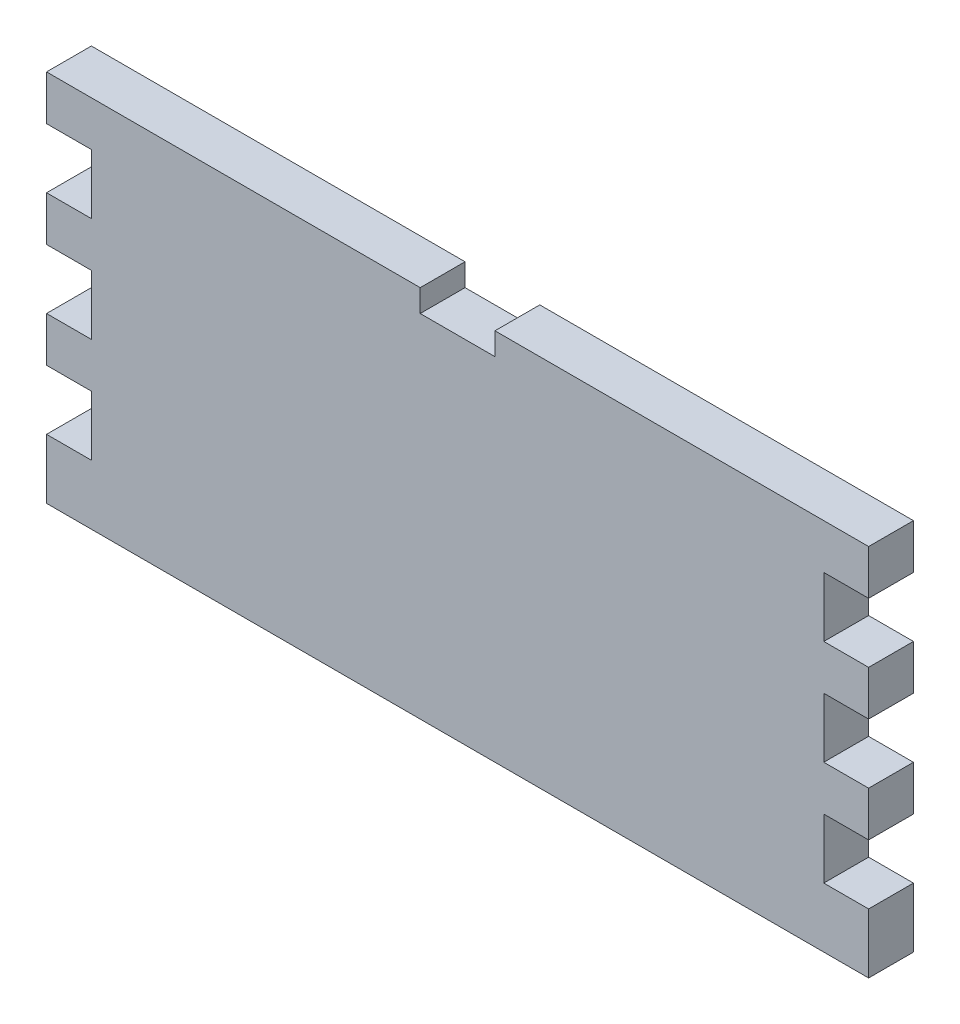
ISO-10303-21;
HEADER;
FILE_DESCRIPTION(('STEP AP214'),'2;1');
FILE_NAME('part.step','',(''),(''),'','','');
FILE_SCHEMA(('AUTOMOTIVE_DESIGN { 1 0 10303 214 1 1 1 1 }'));
ENDSEC;
DATA;
#1=APPLICATION_CONTEXT('core data for automotive mechanical design processes');
#2=APPLICATION_PROTOCOL_DEFINITION('international standard','automotive_design',2000,#1);
#3=PRODUCT_CONTEXT('',#1,'mechanical');
#4=PRODUCT('Part','Part','',(#3));
#5=PRODUCT_RELATED_PRODUCT_CATEGORY('part','',(#4));
#6=PRODUCT_DEFINITION_FORMATION('','',#4);
#7=PRODUCT_DEFINITION_CONTEXT('part definition',#1,'design');
#8=PRODUCT_DEFINITION('design','',#6,#7);
#9=PRODUCT_DEFINITION_SHAPE('','',#8);
#10=(LENGTH_UNIT() NAMED_UNIT(*) SI_UNIT(.MILLI.,.METRE.));
#11=(NAMED_UNIT(*) PLANE_ANGLE_UNIT() SI_UNIT($,.RADIAN.));
#12=(NAMED_UNIT(*) SI_UNIT($,.STERADIAN.) SOLID_ANGLE_UNIT());
#13=UNCERTAINTY_MEASURE_WITH_UNIT(LENGTH_MEASURE(1.E-05),#10,'distance_accuracy_value','');
#14=(GEOMETRIC_REPRESENTATION_CONTEXT(3) GLOBAL_UNCERTAINTY_ASSIGNED_CONTEXT((#13)) GLOBAL_UNIT_ASSIGNED_CONTEXT((#10,
#11,#12)) REPRESENTATION_CONTEXT('',''));
#15=CARTESIAN_POINT('',(0.,0.,0.));
#16=DIRECTION('',(0.,0.,1.));
#17=DIRECTION('',(1.,0.,0.));
#18=AXIS2_PLACEMENT_3D('',#15,#16,#17);
#19=CARTESIAN_POINT('',(27.5,-12.5,3.));
#20=DIRECTION('',(-1.,0.,0.));
#21=DIRECTION('',(0.,0.,1.));
#22=AXIS2_PLACEMENT_3D('',#19,#20,#21);
#23=PLANE('',#22);
#24=DIRECTION('',(0.,1.,0.));
#25=VECTOR('',#24,1.);
#26=CARTESIAN_POINT('',(27.5,-12.5,0.));
#27=LINE('',#26,#25);
#28=CARTESIAN_POINT('',(27.5,2.5,0.));
#29=VERTEX_POINT('',#28);
#30=CARTESIAN_POINT('',(27.5,5.5,0.));
#31=VERTEX_POINT('',#30);
#32=EDGE_CURVE('E270',#29,#31,#27,.T.);
#33=ORIENTED_EDGE('',*,*,#32,.T.);
#34=DIRECTION('',(0.,0.,1.));
#35=VECTOR('',#34,1.);
#36=CARTESIAN_POINT('',(27.5,5.5,0.));
#37=LINE('',#36,#35);
#38=CARTESIAN_POINT('',(27.5,5.5,3.));
#39=VERTEX_POINT('',#38);
#40=EDGE_CURVE('E401',#31,#39,#37,.T.);
#41=ORIENTED_EDGE('',*,*,#40,.T.);
#42=DIRECTION('',(0.,1.,0.));
#43=VECTOR('',#42,1.);
#44=CARTESIAN_POINT('',(27.5,-12.5,3.));
#45=LINE('',#44,#43);
#46=CARTESIAN_POINT('',(27.5,2.5,3.));
#47=VERTEX_POINT('',#46);
#48=EDGE_CURVE('E493',#47,#39,#45,.T.);
#49=ORIENTED_EDGE('',*,*,#48,.F.);
#50=DIRECTION('',(0.,0.,1.));
#51=VECTOR('',#50,1.);
#52=CARTESIAN_POINT('',(27.5,2.5,0.));
#53=LINE('',#52,#51);
#54=EDGE_CURVE('E304',#29,#47,#53,.T.);
#55=ORIENTED_EDGE('',*,*,#54,.F.);
#56=EDGE_LOOP('',(#33,#41,#49,#55));
#57=FACE_BOUND('',#56,.T.);
#58=ADVANCED_FACE('F38',(#57),#23,.F.);
#59=CARTESIAN_POINT('',(27.5,-4.5,0.));
#60=VERTEX_POINT('',#59);
#61=CARTESIAN_POINT('',(27.5,-1.5,0.));
#62=VERTEX_POINT('',#61);
#63=EDGE_CURVE('E275',#60,#62,#27,.T.);
#64=ORIENTED_EDGE('',*,*,#63,.T.);
#65=DIRECTION('',(0.,0.,1.));
#66=VECTOR('',#65,1.);
#67=CARTESIAN_POINT('',(27.5,-1.5,0.));
#68=LINE('',#67,#66);
#69=CARTESIAN_POINT('',(27.5,-1.5,3.));
#70=VERTEX_POINT('',#69);
#71=EDGE_CURVE('E293',#62,#70,#68,.T.);
#72=ORIENTED_EDGE('',*,*,#71,.T.);
#73=CARTESIAN_POINT('',(27.5,-4.5,3.));
#74=VERTEX_POINT('',#73);
#75=EDGE_CURVE('E442',#74,#70,#45,.T.);
#76=ORIENTED_EDGE('',*,*,#75,.F.);
#77=DIRECTION('',(0.,0.,1.));
#78=VECTOR('',#77,1.);
#79=CARTESIAN_POINT('',(27.5,-4.5,0.));
#80=LINE('',#79,#78);
#81=EDGE_CURVE('E295',#60,#74,#80,.T.);
#82=ORIENTED_EDGE('',*,*,#81,.F.);
#83=EDGE_LOOP('',(#64,#72,#76,#82));
#84=FACE_BOUND('',#83,.T.);
#85=ADVANCED_FACE('F291',(#84),#23,.F.);
#86=CARTESIAN_POINT('',(27.5,-12.5,0.));
#87=VERTEX_POINT('',#86);
#88=CARTESIAN_POINT('',(27.5,-8.5,0.));
#89=VERTEX_POINT('',#88);
#90=EDGE_CURVE('E273',#87,#89,#27,.T.);
#91=ORIENTED_EDGE('',*,*,#90,.T.);
#92=DIRECTION('',(0.,0.,1.));
#93=VECTOR('',#92,1.);
#94=CARTESIAN_POINT('',(27.5,-8.5,0.));
#95=LINE('',#94,#93);
#96=CARTESIAN_POINT('',(27.5,-8.5,3.));
#97=VERTEX_POINT('',#96);
#98=EDGE_CURVE('E322',#89,#97,#95,.T.);
#99=ORIENTED_EDGE('',*,*,#98,.T.);
#100=CARTESIAN_POINT('',(27.5,-12.5,3.));
#101=VERTEX_POINT('',#100);
#102=EDGE_CURVE('E438',#101,#97,#45,.T.);
#103=ORIENTED_EDGE('',*,*,#102,.F.);
#104=DIRECTION('',(0.,0.,-1.));
#105=VECTOR('',#104,1.);
#106=CARTESIAN_POINT('',(27.5,-12.5,3.));
#107=LINE('',#106,#105);
#108=EDGE_CURVE('E451',#101,#87,#107,.T.);
#109=ORIENTED_EDGE('',*,*,#108,.T.);
#110=EDGE_LOOP('',(#91,#99,#103,#109));
#111=FACE_BOUND('',#110,.T.);
#112=ADVANCED_FACE('F511',(#111),#23,.F.);
#113=CARTESIAN_POINT('',(-27.5,-12.5,3.));
#114=DIRECTION('',(1.,0.,0.));
#115=DIRECTION('',(0.,0.,-1.));
#116=AXIS2_PLACEMENT_3D('',#113,#114,#115);
#117=PLANE('',#116);
#118=DIRECTION('',(0.,-1.,0.));
#119=VECTOR('',#118,1.);
#120=CARTESIAN_POINT('',(-27.5,-12.5,0.));
#121=LINE('',#120,#119);
#122=CARTESIAN_POINT('',(-27.5,12.5,0.));
#123=VERTEX_POINT('',#122);
#124=CARTESIAN_POINT('',(-27.5,9.50000000000001,0.));
#125=VERTEX_POINT('',#124);
#126=EDGE_CURVE('E470',#123,#125,#121,.T.);
#127=ORIENTED_EDGE('',*,*,#126,.T.);
#128=DIRECTION('',(0.,0.,1.));
#129=VECTOR('',#128,1.);
#130=CARTESIAN_POINT('',(-27.5,9.50000000000001,0.));
#131=LINE('',#130,#129);
#132=CARTESIAN_POINT('',(-27.5,9.50000000000001,3.));
#133=VERTEX_POINT('',#132);
#134=EDGE_CURVE('E356',#125,#133,#131,.T.);
#135=ORIENTED_EDGE('',*,*,#134,.T.);
#136=DIRECTION('',(0.,-1.,0.));
#137=VECTOR('',#136,1.);
#138=CARTESIAN_POINT('',(-27.5,-12.5,3.));
#139=LINE('',#138,#137);
#140=CARTESIAN_POINT('',(-27.5,12.5,3.));
#141=VERTEX_POINT('',#140);
#142=EDGE_CURVE('E447',#141,#133,#139,.T.);
#143=ORIENTED_EDGE('',*,*,#142,.F.);
#144=DIRECTION('',(0.,0.,-1.));
#145=VECTOR('',#144,1.);
#146=CARTESIAN_POINT('',(-27.5,12.5,3.));
#147=LINE('',#146,#145);
#148=EDGE_CURVE('E46',#141,#123,#147,.T.);
#149=ORIENTED_EDGE('',*,*,#148,.T.);
#150=EDGE_LOOP('',(#127,#135,#143,#149));
#151=FACE_BOUND('',#150,.T.);
#152=ADVANCED_FACE('F469',(#151),#117,.F.);
#153=CARTESIAN_POINT('',(-27.5,5.50000000000001,3.));
#154=VERTEX_POINT('',#153);
#155=CARTESIAN_POINT('',(-27.5,2.50000000000001,3.));
#156=VERTEX_POINT('',#155);
#157=EDGE_CURVE('E450',#154,#156,#139,.T.);
#158=ORIENTED_EDGE('',*,*,#157,.F.);
#159=DIRECTION('',(0.,0.,1.));
#160=VECTOR('',#159,1.);
#161=CARTESIAN_POINT('',(-27.5,5.50000000000001,0.));
#162=LINE('',#161,#160);
#163=CARTESIAN_POINT('',(-27.5,5.50000000000001,0.));
#164=VERTEX_POINT('',#163);
#165=EDGE_CURVE('E347',#164,#154,#162,.T.);
#166=ORIENTED_EDGE('',*,*,#165,.F.);
#167=CARTESIAN_POINT('',(-27.5,2.50000000000001,0.));
#168=VERTEX_POINT('',#167);
#169=EDGE_CURVE('E475',#164,#168,#121,.T.);
#170=ORIENTED_EDGE('',*,*,#169,.T.);
#171=DIRECTION('',(0.,0.,1.));
#172=VECTOR('',#171,1.);
#173=CARTESIAN_POINT('',(-27.5,2.50000000000001,0.));
#174=LINE('',#173,#172);
#175=EDGE_CURVE('E372',#168,#156,#174,.T.);
#176=ORIENTED_EDGE('',*,*,#175,.T.);
#177=EDGE_LOOP('',(#158,#166,#170,#176));
#178=FACE_BOUND('',#177,.T.);
#179=ADVANCED_FACE('F518',(#178),#117,.F.);
#180=CARTESIAN_POINT('',(-27.5,-1.5,3.));
#181=VERTEX_POINT('',#180);
#182=CARTESIAN_POINT('',(-27.5,-4.5,3.));
#183=VERTEX_POINT('',#182);
#184=EDGE_CURVE('E650',#181,#183,#139,.T.);
#185=ORIENTED_EDGE('',*,*,#184,.F.);
#186=DIRECTION('',(0.,0.,1.));
#187=VECTOR('',#186,1.);
#188=CARTESIAN_POINT('',(-27.5,-1.5,0.));
#189=LINE('',#188,#187);
#190=CARTESIAN_POINT('',(-27.5,-1.5,0.));
#191=VERTEX_POINT('',#190);
#192=EDGE_CURVE('E365',#191,#181,#189,.T.);
#193=ORIENTED_EDGE('',*,*,#192,.F.);
#194=CARTESIAN_POINT('',(-27.5,-4.5,0.));
#195=VERTEX_POINT('',#194);
#196=EDGE_CURVE('E478',#191,#195,#121,.T.);
#197=ORIENTED_EDGE('',*,*,#196,.T.);
#198=DIRECTION('',(0.,0.,1.));
#199=VECTOR('',#198,1.);
#200=CARTESIAN_POINT('',(-27.5,-4.5,0.));
#201=LINE('',#200,#199);
#202=EDGE_CURVE('E398',#195,#183,#201,.T.);
#203=ORIENTED_EDGE('',*,*,#202,.T.);
#204=EDGE_LOOP('',(#185,#193,#197,#203));
#205=FACE_BOUND('',#204,.T.);
#206=ADVANCED_FACE('F627',(#205),#117,.F.);
#207=CARTESIAN_POINT('',(-27.5,12.5,3.));
#208=DIRECTION('',(0.,-1.,0.));
#209=DIRECTION('',(0.,0.,-1.));
#210=AXIS2_PLACEMENT_3D('',#207,#208,#209);
#211=PLANE('',#210);
#212=DIRECTION('',(-1.,0.,0.));
#213=VECTOR('',#212,1.);
#214=CARTESIAN_POINT('',(-27.5,12.5,3.));
#215=LINE('',#214,#213);
#216=CARTESIAN_POINT('',(-2.49999999999998,12.5,3.));
#217=VERTEX_POINT('',#216);
#218=EDGE_CURVE('E441',#217,#141,#215,.T.);
#219=ORIENTED_EDGE('',*,*,#218,.F.);
#220=DIRECTION('',(0.,0.,1.));
#221=VECTOR('',#220,1.);
#222=CARTESIAN_POINT('',(-2.49999999999998,12.5,0.));
#223=LINE('',#222,#221);
#224=CARTESIAN_POINT('',(-2.49999999999998,12.5,0.));
#225=VERTEX_POINT('',#224);
#226=EDGE_CURVE('E271',#225,#217,#223,.T.);
#227=ORIENTED_EDGE('',*,*,#226,.F.);
#228=DIRECTION('',(-1.,0.,0.));
#229=VECTOR('',#228,1.);
#230=CARTESIAN_POINT('',(-27.5,12.5,0.));
#231=LINE('',#230,#229);
#232=EDGE_CURVE('E281',#225,#123,#231,.T.);
#233=ORIENTED_EDGE('',*,*,#232,.T.);
#234=ORIENTED_EDGE('',*,*,#148,.F.);
#235=EDGE_LOOP('',(#219,#227,#233,#234));
#236=FACE_BOUND('',#235,.T.);
#237=ADVANCED_FACE('F521',(#236),#211,.F.);
#238=CARTESIAN_POINT('',(27.5,9.50000000000001,3.));
#239=VERTEX_POINT('',#238);
#240=CARTESIAN_POINT('',(27.5,12.5,3.));
#241=VERTEX_POINT('',#240);
#242=EDGE_CURVE('E262',#239,#241,#45,.T.);
#243=ORIENTED_EDGE('',*,*,#242,.F.);
#244=DIRECTION('',(0.,0.,1.));
#245=VECTOR('',#244,1.);
#246=CARTESIAN_POINT('',(27.5,9.50000000000001,0.));
#247=LINE('',#246,#245);
#248=CARTESIAN_POINT('',(27.5,9.50000000000001,0.));
#249=VERTEX_POINT('',#248);
#250=EDGE_CURVE('E250',#249,#239,#247,.T.);
#251=ORIENTED_EDGE('',*,*,#250,.F.);
#252=CARTESIAN_POINT('',(27.5,12.5,0.));
#253=VERTEX_POINT('',#252);
#254=EDGE_CURVE('E260',#249,#253,#27,.T.);
#255=ORIENTED_EDGE('',*,*,#254,.T.);
#256=DIRECTION('',(0.,0.,-1.));
#257=VECTOR('',#256,1.);
#258=CARTESIAN_POINT('',(27.5,12.5,3.));
#259=LINE('',#258,#257);
#260=EDGE_CURVE('E11',#241,#253,#259,.T.);
#261=ORIENTED_EDGE('',*,*,#260,.F.);
#262=EDGE_LOOP('',(#243,#251,#255,#261));
#263=FACE_BOUND('',#262,.T.);
#264=ADVANCED_FACE('F40',(#263),#23,.F.);
#265=CARTESIAN_POINT('',(2.50000000000001,12.5,0.));
#266=VERTEX_POINT('',#265);
#267=EDGE_CURVE('E269',#253,#266,#231,.T.);
#268=ORIENTED_EDGE('',*,*,#267,.T.);
#269=DIRECTION('',(0.,0.,1.));
#270=VECTOR('',#269,1.);
#271=CARTESIAN_POINT('',(2.50000000000001,12.5,0.));
#272=LINE('',#271,#270);
#273=CARTESIAN_POINT('',(2.50000000000001,12.5,3.));
#274=VERTEX_POINT('',#273);
#275=EDGE_CURVE('E276',#266,#274,#272,.T.);
#276=ORIENTED_EDGE('',*,*,#275,.T.);
#277=EDGE_CURVE('E443',#241,#274,#215,.T.);
#278=ORIENTED_EDGE('',*,*,#277,.F.);
#279=ORIENTED_EDGE('',*,*,#260,.T.);
#280=EDGE_LOOP('',(#268,#276,#278,#279));
#281=FACE_BOUND('',#280,.T.);
#282=ADVANCED_FACE('F485',(#281),#211,.F.);
#283=CARTESIAN_POINT('',(-27.5,-8.49999999999999,3.));
#284=VERTEX_POINT('',#283);
#285=CARTESIAN_POINT('',(-27.5,-12.5,3.));
#286=VERTEX_POINT('',#285);
#287=EDGE_CURVE('E446',#284,#286,#139,.T.);
#288=ORIENTED_EDGE('',*,*,#287,.F.);
#289=DIRECTION('',(0.,0.,1.));
#290=VECTOR('',#289,1.);
#291=CARTESIAN_POINT('',(-27.5,-8.49999999999999,0.));
#292=LINE('',#291,#290);
#293=CARTESIAN_POINT('',(-27.5,-8.49999999999999,0.));
#294=VERTEX_POINT('',#293);
#295=EDGE_CURVE('E391',#294,#284,#292,.T.);
#296=ORIENTED_EDGE('',*,*,#295,.F.);
#297=CARTESIAN_POINT('',(-27.5,-12.5,0.));
#298=VERTEX_POINT('',#297);
#299=EDGE_CURVE('E476',#294,#298,#121,.T.);
#300=ORIENTED_EDGE('',*,*,#299,.T.);
#301=DIRECTION('',(0.,0.,-1.));
#302=VECTOR('',#301,1.);
#303=CARTESIAN_POINT('',(-27.5,-12.5,3.));
#304=LINE('',#303,#302);
#305=EDGE_CURVE('E455',#286,#298,#304,.T.);
#306=ORIENTED_EDGE('',*,*,#305,.F.);
#307=EDGE_LOOP('',(#288,#296,#300,#306));
#308=FACE_BOUND('',#307,.T.);
#309=ADVANCED_FACE('F520',(#308),#117,.F.);
#310=CARTESIAN_POINT('',(-27.5,-12.5,3.));
#311=DIRECTION('',(0.,1.,0.));
#312=DIRECTION('',(0.,0.,1.));
#313=AXIS2_PLACEMENT_3D('',#310,#311,#312);
#314=PLANE('',#313);
#315=DIRECTION('',(1.,0.,0.));
#316=VECTOR('',#315,1.);
#317=CARTESIAN_POINT('',(-27.5,-12.5,0.));
#318=LINE('',#317,#316);
#319=EDGE_CURVE('E461',#298,#87,#318,.T.);
#320=ORIENTED_EDGE('',*,*,#319,.T.);
#321=ORIENTED_EDGE('',*,*,#108,.F.);
#322=DIRECTION('',(1.,0.,0.));
#323=VECTOR('',#322,1.);
#324=CARTESIAN_POINT('',(-27.5,-12.5,3.));
#325=LINE('',#324,#323);
#326=EDGE_CURVE('E449',#286,#101,#325,.T.);
#327=ORIENTED_EDGE('',*,*,#326,.F.);
#328=ORIENTED_EDGE('',*,*,#305,.T.);
#329=EDGE_LOOP('',(#320,#321,#327,#328));
#330=FACE_BOUND('',#329,.T.);
#331=ADVANCED_FACE('F621',(#330),#314,.F.);
#332=CARTESIAN_POINT('',(0.,0.,3.));
#333=DIRECTION('',(0.,0.,-1.));
#334=DIRECTION('',(-1.,0.,0.));
#335=AXIS2_PLACEMENT_3D('',#332,#333,#334);
#336=PLANE('',#335);
#337=ORIENTED_EDGE('',*,*,#48,.T.);
#338=DIRECTION('',(1.,0.,0.));
#339=VECTOR('',#338,1.);
#340=CARTESIAN_POINT('',(27.5,5.5,3.));
#341=LINE('',#340,#339);
#342=CARTESIAN_POINT('',(24.5,5.5,3.));
#343=VERTEX_POINT('',#342);
#344=EDGE_CURVE('E255',#343,#39,#341,.T.);
#345=ORIENTED_EDGE('',*,*,#344,.F.);
#346=DIRECTION('',(0.,-1.,0.));
#347=VECTOR('',#346,1.);
#348=CARTESIAN_POINT('',(24.5,9.5,3.));
#349=LINE('',#348,#347);
#350=CARTESIAN_POINT('',(24.5,9.5,3.));
#351=VERTEX_POINT('',#350);
#352=EDGE_CURVE('E536',#351,#343,#349,.T.);
#353=ORIENTED_EDGE('',*,*,#352,.F.);
#354=DIRECTION('',(-1.,0.,0.));
#355=VECTOR('',#354,1.);
#356=CARTESIAN_POINT('',(27.5,9.50000000000001,3.));
#357=LINE('',#356,#355);
#358=EDGE_CURVE('E492',#239,#351,#357,.T.);
#359=ORIENTED_EDGE('',*,*,#358,.F.);
#360=ORIENTED_EDGE('',*,*,#242,.T.);
#361=ORIENTED_EDGE('',*,*,#277,.T.);
#362=DIRECTION('',(0.,1.,0.));
#363=VECTOR('',#362,1.);
#364=CARTESIAN_POINT('',(2.50000000000001,12.5,3.));
#365=LINE('',#364,#363);
#366=CARTESIAN_POINT('',(2.50000000000002,11.,3.));
#367=VERTEX_POINT('',#366);
#368=EDGE_CURVE('E421',#367,#274,#365,.T.);
#369=ORIENTED_EDGE('',*,*,#368,.F.);
#370=DIRECTION('',(1.,0.,0.));
#371=VECTOR('',#370,1.);
#372=CARTESIAN_POINT('',(-2.49999999999998,11.,3.));
#373=LINE('',#372,#371);
#374=CARTESIAN_POINT('',(-2.49999999999998,11.,3.));
#375=VERTEX_POINT('',#374);
#376=EDGE_CURVE('E429',#375,#367,#373,.T.);
#377=ORIENTED_EDGE('',*,*,#376,.F.);
#378=DIRECTION('',(0.,-1.,0.));
#379=VECTOR('',#378,1.);
#380=CARTESIAN_POINT('',(-2.49999999999998,12.5,3.));
#381=LINE('',#380,#379);
#382=EDGE_CURVE('E359',#217,#375,#381,.T.);
#383=ORIENTED_EDGE('',*,*,#382,.F.);
#384=ORIENTED_EDGE('',*,*,#218,.T.);
#385=ORIENTED_EDGE('',*,*,#142,.T.);
#386=DIRECTION('',(-1.,0.,0.));
#387=VECTOR('',#386,1.);
#388=CARTESIAN_POINT('',(-27.5,9.50000000000001,3.));
#389=LINE('',#388,#387);
#390=CARTESIAN_POINT('',(-24.5,9.50000000000001,3.));
#391=VERTEX_POINT('',#390);
#392=EDGE_CURVE('E341',#391,#133,#389,.T.);
#393=ORIENTED_EDGE('',*,*,#392,.F.);
#394=DIRECTION('',(0.,1.,0.));
#395=VECTOR('',#394,1.);
#396=CARTESIAN_POINT('',(-24.5,9.50000000000001,3.));
#397=LINE('',#396,#395);
#398=CARTESIAN_POINT('',(-24.5,5.50000000000001,3.));
#399=VERTEX_POINT('',#398);
#400=EDGE_CURVE('E351',#399,#391,#397,.T.);
#401=ORIENTED_EDGE('',*,*,#400,.F.);
#402=DIRECTION('',(1.,0.,0.));
#403=VECTOR('',#402,1.);
#404=CARTESIAN_POINT('',(-27.5,5.50000000000001,3.));
#405=LINE('',#404,#403);
#406=EDGE_CURVE('E348',#154,#399,#405,.T.);
#407=ORIENTED_EDGE('',*,*,#406,.F.);
#408=ORIENTED_EDGE('',*,*,#157,.T.);
#409=DIRECTION('',(-1.,0.,0.));
#410=VECTOR('',#409,1.);
#411=CARTESIAN_POINT('',(-27.5,2.50000000000001,3.));
#412=LINE('',#411,#410);
#413=CARTESIAN_POINT('',(-24.5,2.5,3.));
#414=VERTEX_POINT('',#413);
#415=EDGE_CURVE('E376',#414,#156,#412,.T.);
#416=ORIENTED_EDGE('',*,*,#415,.F.);
#417=DIRECTION('',(0.,1.,0.));
#418=VECTOR('',#417,1.);
#419=CARTESIAN_POINT('',(-24.5,2.5,3.));
#420=LINE('',#419,#418);
#421=CARTESIAN_POINT('',(-24.5,-1.5,3.));
#422=VERTEX_POINT('',#421);
#423=EDGE_CURVE('E378',#422,#414,#420,.T.);
#424=ORIENTED_EDGE('',*,*,#423,.F.);
#425=DIRECTION('',(1.,0.,0.));
#426=VECTOR('',#425,1.);
#427=CARTESIAN_POINT('',(-27.5,-1.5,3.));
#428=LINE('',#427,#426);
#429=EDGE_CURVE('E352',#181,#422,#428,.T.);
#430=ORIENTED_EDGE('',*,*,#429,.F.);
#431=ORIENTED_EDGE('',*,*,#184,.T.);
#432=DIRECTION('',(-1.,0.,0.));
#433=VECTOR('',#432,1.);
#434=CARTESIAN_POINT('',(-27.5,-4.5,3.));
#435=LINE('',#434,#433);
#436=CARTESIAN_POINT('',(-24.5,-4.5,3.));
#437=VERTEX_POINT('',#436);
#438=EDGE_CURVE('E402',#437,#183,#435,.T.);
#439=ORIENTED_EDGE('',*,*,#438,.F.);
#440=DIRECTION('',(0.,1.,0.));
#441=VECTOR('',#440,1.);
#442=CARTESIAN_POINT('',(-24.5,-4.5,3.));
#443=LINE('',#442,#441);
#444=CARTESIAN_POINT('',(-24.5,-8.49999999999999,3.));
#445=VERTEX_POINT('',#444);
#446=EDGE_CURVE('E404',#445,#437,#443,.T.);
#447=ORIENTED_EDGE('',*,*,#446,.F.);
#448=DIRECTION('',(1.,0.,0.));
#449=VECTOR('',#448,1.);
#450=CARTESIAN_POINT('',(-27.5,-8.49999999999999,3.));
#451=LINE('',#450,#449);
#452=EDGE_CURVE('E375',#284,#445,#451,.T.);
#453=ORIENTED_EDGE('',*,*,#452,.F.);
#454=ORIENTED_EDGE('',*,*,#287,.T.);
#455=ORIENTED_EDGE('',*,*,#326,.T.);
#456=ORIENTED_EDGE('',*,*,#102,.T.);
#457=DIRECTION('',(1.,0.,0.));
#458=VECTOR('',#457,1.);
#459=CARTESIAN_POINT('',(27.5,-8.5,3.));
#460=LINE('',#459,#458);
#461=CARTESIAN_POINT('',(24.5,-8.49999999999999,3.));
#462=VERTEX_POINT('',#461);
#463=EDGE_CURVE('E324',#462,#97,#460,.T.);
#464=ORIENTED_EDGE('',*,*,#463,.F.);
#465=DIRECTION('',(0.,-1.,0.));
#466=VECTOR('',#465,1.);
#467=CARTESIAN_POINT('',(24.5,-4.5,3.));
#468=LINE('',#467,#466);
#469=CARTESIAN_POINT('',(24.5,-4.5,3.));
#470=VERTEX_POINT('',#469);
#471=EDGE_CURVE('E326',#470,#462,#468,.T.);
#472=ORIENTED_EDGE('',*,*,#471,.F.);
#473=DIRECTION('',(-1.,0.,0.));
#474=VECTOR('',#473,1.);
#475=CARTESIAN_POINT('',(27.5,-4.5,3.));
#476=LINE('',#475,#474);
#477=EDGE_CURVE('E329',#74,#470,#476,.T.);
#478=ORIENTED_EDGE('',*,*,#477,.F.);
#479=ORIENTED_EDGE('',*,*,#75,.T.);
#480=DIRECTION('',(1.,0.,0.));
#481=VECTOR('',#480,1.);
#482=CARTESIAN_POINT('',(27.5,-1.5,3.));
#483=LINE('',#482,#481);
#484=CARTESIAN_POINT('',(24.5,-1.5,3.));
#485=VERTEX_POINT('',#484);
#486=EDGE_CURVE('E315',#485,#70,#483,.T.);
#487=ORIENTED_EDGE('',*,*,#486,.F.);
#488=DIRECTION('',(0.,-1.,0.));
#489=VECTOR('',#488,1.);
#490=CARTESIAN_POINT('',(24.5,2.5,3.));
#491=LINE('',#490,#489);
#492=CARTESIAN_POINT('',(24.5,2.5,3.));
#493=VERTEX_POINT('',#492);
#494=EDGE_CURVE('E548',#493,#485,#491,.T.);
#495=ORIENTED_EDGE('',*,*,#494,.F.);
#496=DIRECTION('',(-1.,0.,0.));
#497=VECTOR('',#496,1.);
#498=CARTESIAN_POINT('',(27.5,2.5,3.));
#499=LINE('',#498,#497);
#500=EDGE_CURVE('E311',#47,#493,#499,.T.);
#501=ORIENTED_EDGE('',*,*,#500,.F.);
#502=EDGE_LOOP('',(#337,#345,#353,#359,#360,#361,#369,#377,#383,#384,#385,#393,#401,#407,#408,
#416,#424,#430,#431,#439,#447,#453,#454,#455,#456,#464,#472,#478,#479,#487,#495,#501));
#503=FACE_BOUND('',#502,.T.);
#504=ADVANCED_FACE('F489',(#503),#336,.F.);
#505=CARTESIAN_POINT('',(0.,0.,0.));
#506=DIRECTION('',(0.,0.,-1.));
#507=DIRECTION('',(-1.,0.,0.));
#508=AXIS2_PLACEMENT_3D('',#505,#506,#507);
#509=PLANE('',#508);
#510=DIRECTION('',(1.,0.,0.));
#511=VECTOR('',#510,1.);
#512=CARTESIAN_POINT('',(27.5,5.5,0.));
#513=LINE('',#512,#511);
#514=CARTESIAN_POINT('',(24.5,5.5,0.));
#515=VERTEX_POINT('',#514);
#516=EDGE_CURVE('E263',#515,#31,#513,.T.);
#517=ORIENTED_EDGE('',*,*,#516,.T.);
#518=ORIENTED_EDGE('',*,*,#32,.F.);
#519=DIRECTION('',(-1.,0.,0.));
#520=VECTOR('',#519,1.);
#521=CARTESIAN_POINT('',(27.5,2.5,0.));
#522=LINE('',#521,#520);
#523=CARTESIAN_POINT('',(24.5,2.5,0.));
#524=VERTEX_POINT('',#523);
#525=EDGE_CURVE('E306',#29,#524,#522,.T.);
#526=ORIENTED_EDGE('',*,*,#525,.T.);
#527=DIRECTION('',(0.,-1.,0.));
#528=VECTOR('',#527,1.);
#529=CARTESIAN_POINT('',(24.5,2.5,0.));
#530=LINE('',#529,#528);
#531=CARTESIAN_POINT('',(24.5,-1.5,0.));
#532=VERTEX_POINT('',#531);
#533=EDGE_CURVE('E61',#524,#532,#530,.T.);
#534=ORIENTED_EDGE('',*,*,#533,.T.);
#535=DIRECTION('',(1.,0.,0.));
#536=VECTOR('',#535,1.);
#537=CARTESIAN_POINT('',(27.5,-1.5,0.));
#538=LINE('',#537,#536);
#539=EDGE_CURVE('E301',#532,#62,#538,.T.);
#540=ORIENTED_EDGE('',*,*,#539,.T.);
#541=ORIENTED_EDGE('',*,*,#63,.F.);
#542=DIRECTION('',(-1.,0.,0.));
#543=VECTOR('',#542,1.);
#544=CARTESIAN_POINT('',(27.5,-4.5,0.));
#545=LINE('',#544,#543);
#546=CARTESIAN_POINT('',(24.5,-4.5,0.));
#547=VERTEX_POINT('',#546);
#548=EDGE_CURVE('E299',#60,#547,#545,.T.);
#549=ORIENTED_EDGE('',*,*,#548,.T.);
#550=DIRECTION('',(0.,-1.,0.));
#551=VECTOR('',#550,1.);
#552=CARTESIAN_POINT('',(24.5,-4.5,0.));
#553=LINE('',#552,#551);
#554=CARTESIAN_POINT('',(24.5,-8.49999999999999,0.));
#555=VERTEX_POINT('',#554);
#556=EDGE_CURVE('E334',#547,#555,#553,.T.);
#557=ORIENTED_EDGE('',*,*,#556,.T.);
#558=DIRECTION('',(1.,0.,0.));
#559=VECTOR('',#558,1.);
#560=CARTESIAN_POINT('',(27.5,-8.5,0.));
#561=LINE('',#560,#559);
#562=EDGE_CURVE('E317',#555,#89,#561,.T.);
#563=ORIENTED_EDGE('',*,*,#562,.T.);
#564=ORIENTED_EDGE('',*,*,#90,.F.);
#565=ORIENTED_EDGE('',*,*,#319,.F.);
#566=ORIENTED_EDGE('',*,*,#299,.F.);
#567=DIRECTION('',(1.,0.,0.));
#568=VECTOR('',#567,1.);
#569=CARTESIAN_POINT('',(-27.5,-8.49999999999999,0.));
#570=LINE('',#569,#568);
#571=CARTESIAN_POINT('',(-24.5,-8.49999999999999,0.));
#572=VERTEX_POINT('',#571);
#573=EDGE_CURVE('E405',#294,#572,#570,.T.);
#574=ORIENTED_EDGE('',*,*,#573,.T.);
#575=DIRECTION('',(0.,1.,0.));
#576=VECTOR('',#575,1.);
#577=CARTESIAN_POINT('',(-24.5,-4.5,0.));
#578=LINE('',#577,#576);
#579=CARTESIAN_POINT('',(-24.5,-4.5,0.));
#580=VERTEX_POINT('',#579);
#581=EDGE_CURVE('E412',#572,#580,#578,.T.);
#582=ORIENTED_EDGE('',*,*,#581,.T.);
#583=DIRECTION('',(-1.,0.,0.));
#584=VECTOR('',#583,1.);
#585=CARTESIAN_POINT('',(-27.5,-4.5,0.));
#586=LINE('',#585,#584);
#587=EDGE_CURVE('E393',#580,#195,#586,.T.);
#588=ORIENTED_EDGE('',*,*,#587,.T.);
#589=ORIENTED_EDGE('',*,*,#196,.F.);
#590=DIRECTION('',(1.,0.,0.));
#591=VECTOR('',#590,1.);
#592=CARTESIAN_POINT('',(-27.5,-1.5,0.));
#593=LINE('',#592,#591);
#594=CARTESIAN_POINT('',(-24.5,-1.5,0.));
#595=VERTEX_POINT('',#594);
#596=EDGE_CURVE('E379',#191,#595,#593,.T.);
#597=ORIENTED_EDGE('',*,*,#596,.T.);
#598=DIRECTION('',(0.,1.,0.));
#599=VECTOR('',#598,1.);
#600=CARTESIAN_POINT('',(-24.5,2.5,0.));
#601=LINE('',#600,#599);
#602=CARTESIAN_POINT('',(-24.5,2.5,0.));
#603=VERTEX_POINT('',#602);
#604=EDGE_CURVE('E386',#595,#603,#601,.T.);
#605=ORIENTED_EDGE('',*,*,#604,.T.);
#606=DIRECTION('',(-1.,0.,0.));
#607=VECTOR('',#606,1.);
#608=CARTESIAN_POINT('',(-27.5,2.50000000000001,0.));
#609=LINE('',#608,#607);
#610=EDGE_CURVE('E367',#603,#168,#609,.T.);
#611=ORIENTED_EDGE('',*,*,#610,.T.);
#612=ORIENTED_EDGE('',*,*,#169,.F.);
#613=DIRECTION('',(1.,0.,0.));
#614=VECTOR('',#613,1.);
#615=CARTESIAN_POINT('',(-27.5,5.50000000000001,0.));
#616=LINE('',#615,#614);
#617=CARTESIAN_POINT('',(-24.5,5.50000000000001,0.));
#618=VERTEX_POINT('',#617);
#619=EDGE_CURVE('E337',#164,#618,#616,.T.);
#620=ORIENTED_EDGE('',*,*,#619,.T.);
#621=DIRECTION('',(0.,1.,0.));
#622=VECTOR('',#621,1.);
#623=CARTESIAN_POINT('',(-24.5,9.50000000000001,0.));
#624=LINE('',#623,#622);
#625=CARTESIAN_POINT('',(-24.5,9.50000000000001,0.));
#626=VERTEX_POINT('',#625);
#627=EDGE_CURVE('E340',#618,#626,#624,.T.);
#628=ORIENTED_EDGE('',*,*,#627,.T.);
#629=DIRECTION('',(-1.,0.,0.));
#630=VECTOR('',#629,1.);
#631=CARTESIAN_POINT('',(-27.5,9.50000000000001,0.));
#632=LINE('',#631,#630);
#633=EDGE_CURVE('E344',#626,#125,#632,.T.);
#634=ORIENTED_EDGE('',*,*,#633,.T.);
#635=ORIENTED_EDGE('',*,*,#126,.F.);
#636=ORIENTED_EDGE('',*,*,#232,.F.);
#637=DIRECTION('',(0.,-1.,0.));
#638=VECTOR('',#637,1.);
#639=CARTESIAN_POINT('',(-2.49999999999998,12.5,0.));
#640=LINE('',#639,#638);
#641=CARTESIAN_POINT('',(-2.49999999999998,11.,0.));
#642=VERTEX_POINT('',#641);
#643=EDGE_CURVE('E417',#225,#642,#640,.T.);
#644=ORIENTED_EDGE('',*,*,#643,.T.);
#645=DIRECTION('',(1.,0.,0.));
#646=VECTOR('',#645,1.);
#647=CARTESIAN_POINT('',(-2.49999999999998,11.,0.));
#648=LINE('',#647,#646);
#649=CARTESIAN_POINT('',(2.50000000000002,11.,0.));
#650=VERTEX_POINT('',#649);
#651=EDGE_CURVE('E420',#642,#650,#648,.T.);
#652=ORIENTED_EDGE('',*,*,#651,.T.);
#653=DIRECTION('',(0.,1.,0.));
#654=VECTOR('',#653,1.);
#655=CARTESIAN_POINT('',(2.50000000000001,12.5,0.));
#656=LINE('',#655,#654);
#657=EDGE_CURVE('E424',#650,#266,#656,.T.);
#658=ORIENTED_EDGE('',*,*,#657,.T.);
#659=ORIENTED_EDGE('',*,*,#267,.F.);
#660=ORIENTED_EDGE('',*,*,#254,.F.);
#661=DIRECTION('',(-1.,0.,0.));
#662=VECTOR('',#661,1.);
#663=CARTESIAN_POINT('',(27.5,9.50000000000001,0.));
#664=LINE('',#663,#662);
#665=CARTESIAN_POINT('',(24.5,9.5,0.));
#666=VERTEX_POINT('',#665);
#667=EDGE_CURVE('E246',#249,#666,#664,.T.);
#668=ORIENTED_EDGE('',*,*,#667,.T.);
#669=DIRECTION('',(0.,-1.,0.));
#670=VECTOR('',#669,1.);
#671=CARTESIAN_POINT('',(24.5,9.5,0.));
#672=LINE('',#671,#670);
#673=EDGE_CURVE('E53',#666,#515,#672,.T.);
#674=ORIENTED_EDGE('',*,*,#673,.T.);
#675=EDGE_LOOP('',(#517,#518,#526,#534,#540,#541,#549,#557,#563,#564,#565,#566,#574,#582,#588,
#589,#597,#605,#611,#612,#620,#628,#634,#635,#636,#644,#652,#658,#659,#660,#668,#674));
#676=FACE_BOUND('',#675,.T.);
#677=ADVANCED_FACE('F266',(#676),#509,.T.);
#678=CARTESIAN_POINT('',(-2.49999999999998,12.5,0.));
#679=DIRECTION('',(-1.,0.,0.));
#680=DIRECTION('',(0.,-1.,0.));
#681=AXIS2_PLACEMENT_3D('',#678,#679,#680);
#682=PLANE('',#681);
#683=ORIENTED_EDGE('',*,*,#382,.T.);
#684=DIRECTION('',(0.,0.,1.));
#685=VECTOR('',#684,1.);
#686=CARTESIAN_POINT('',(-2.49999999999998,11.,0.));
#687=LINE('',#686,#685);
#688=EDGE_CURVE('E426',#642,#375,#687,.T.);
#689=ORIENTED_EDGE('',*,*,#688,.F.);
#690=ORIENTED_EDGE('',*,*,#643,.F.);
#691=ORIENTED_EDGE('',*,*,#226,.T.);
#692=EDGE_LOOP('',(#683,#689,#690,#691));
#693=FACE_BOUND('',#692,.T.);
#694=ADVANCED_FACE('F611',(#693),#682,.F.);
#695=CARTESIAN_POINT('',(2.50000000000001,12.5,0.));
#696=DIRECTION('',(1.,0.,0.));
#697=DIRECTION('',(0.,1.,0.));
#698=AXIS2_PLACEMENT_3D('',#695,#696,#697);
#699=PLANE('',#698);
#700=ORIENTED_EDGE('',*,*,#368,.T.);
#701=ORIENTED_EDGE('',*,*,#275,.F.);
#702=ORIENTED_EDGE('',*,*,#657,.F.);
#703=DIRECTION('',(0.,0.,1.));
#704=VECTOR('',#703,1.);
#705=CARTESIAN_POINT('',(2.50000000000002,11.,0.));
#706=LINE('',#705,#704);
#707=EDGE_CURVE('E435',#650,#367,#706,.T.);
#708=ORIENTED_EDGE('',*,*,#707,.T.);
#709=EDGE_LOOP('',(#700,#701,#702,#708));
#710=FACE_BOUND('',#709,.T.);
#711=ADVANCED_FACE('F608',(#710),#699,.F.);
#712=CARTESIAN_POINT('',(-2.49999999999998,11.,0.));
#713=DIRECTION('',(0.,-1.,0.));
#714=DIRECTION('',(1.,0.,0.));
#715=AXIS2_PLACEMENT_3D('',#712,#713,#714);
#716=PLANE('',#715);
#717=ORIENTED_EDGE('',*,*,#376,.T.);
#718=ORIENTED_EDGE('',*,*,#707,.F.);
#719=ORIENTED_EDGE('',*,*,#651,.F.);
#720=ORIENTED_EDGE('',*,*,#688,.T.);
#721=EDGE_LOOP('',(#717,#718,#719,#720));
#722=FACE_BOUND('',#721,.T.);
#723=ADVANCED_FACE('F606',(#722),#716,.F.);
#724=CARTESIAN_POINT('',(-27.5,-4.5,0.));
#725=DIRECTION('',(0.,1.,0.));
#726=DIRECTION('',(-1.,0.,0.));
#727=AXIS2_PLACEMENT_3D('',#724,#725,#726);
#728=PLANE('',#727);
#729=ORIENTED_EDGE('',*,*,#438,.T.);
#730=ORIENTED_EDGE('',*,*,#202,.F.);
#731=ORIENTED_EDGE('',*,*,#587,.F.);
#732=DIRECTION('',(0.,0.,1.));
#733=VECTOR('',#732,1.);
#734=CARTESIAN_POINT('',(-24.5,-4.5,0.));
#735=LINE('',#734,#733);
#736=EDGE_CURVE('E396',#580,#437,#735,.T.);
#737=ORIENTED_EDGE('',*,*,#736,.T.);
#738=EDGE_LOOP('',(#729,#730,#731,#737));
#739=FACE_BOUND('',#738,.T.);
#740=ADVANCED_FACE('F602',(#739),#728,.F.);
#741=CARTESIAN_POINT('',(-24.5,-4.5,0.));
#742=DIRECTION('',(1.,0.,0.));
#743=DIRECTION('',(0.,0.,-1.));
#744=AXIS2_PLACEMENT_3D('',#741,#742,#743);
#745=PLANE('',#744);
#746=ORIENTED_EDGE('',*,*,#446,.T.);
#747=ORIENTED_EDGE('',*,*,#736,.F.);
#748=ORIENTED_EDGE('',*,*,#581,.F.);
#749=DIRECTION('',(0.,0.,1.));
#750=VECTOR('',#749,1.);
#751=CARTESIAN_POINT('',(-24.5,-8.49999999999999,0.));
#752=LINE('',#751,#750);
#753=EDGE_CURVE('E394',#572,#445,#752,.T.);
#754=ORIENTED_EDGE('',*,*,#753,.T.);
#755=EDGE_LOOP('',(#746,#747,#748,#754));
#756=FACE_BOUND('',#755,.T.);
#757=ADVANCED_FACE('F598',(#756),#745,.F.);
#758=CARTESIAN_POINT('',(-27.5,-8.49999999999999,0.));
#759=DIRECTION('',(0.,-1.,0.));
#760=DIRECTION('',(0.,0.,-1.));
#761=AXIS2_PLACEMENT_3D('',#758,#759,#760);
#762=PLANE('',#761);
#763=ORIENTED_EDGE('',*,*,#452,.T.);
#764=ORIENTED_EDGE('',*,*,#753,.F.);
#765=ORIENTED_EDGE('',*,*,#573,.F.);
#766=ORIENTED_EDGE('',*,*,#295,.T.);
#767=EDGE_LOOP('',(#763,#764,#765,#766));
#768=FACE_BOUND('',#767,.T.);
#769=ADVANCED_FACE('F594',(#768),#762,.F.);
#770=CARTESIAN_POINT('',(-27.5,2.50000000000001,0.));
#771=DIRECTION('',(0.,1.,0.));
#772=DIRECTION('',(-1.,0.,0.));
#773=AXIS2_PLACEMENT_3D('',#770,#771,#772);
#774=PLANE('',#773);
#775=ORIENTED_EDGE('',*,*,#415,.T.);
#776=ORIENTED_EDGE('',*,*,#175,.F.);
#777=ORIENTED_EDGE('',*,*,#610,.F.);
#778=DIRECTION('',(0.,0.,1.));
#779=VECTOR('',#778,1.);
#780=CARTESIAN_POINT('',(-24.5,2.5,0.));
#781=LINE('',#780,#779);
#782=EDGE_CURVE('E370',#603,#414,#781,.T.);
#783=ORIENTED_EDGE('',*,*,#782,.T.);
#784=EDGE_LOOP('',(#775,#776,#777,#783));
#785=FACE_BOUND('',#784,.T.);
#786=ADVANCED_FACE('F590',(#785),#774,.F.);
#787=CARTESIAN_POINT('',(-24.5,2.5,0.));
#788=DIRECTION('',(1.,0.,0.));
#789=DIRECTION('',(0.,0.,-1.));
#790=AXIS2_PLACEMENT_3D('',#787,#788,#789);
#791=PLANE('',#790);
#792=ORIENTED_EDGE('',*,*,#423,.T.);
#793=ORIENTED_EDGE('',*,*,#782,.F.);
#794=ORIENTED_EDGE('',*,*,#604,.F.);
#795=DIRECTION('',(0.,0.,1.));
#796=VECTOR('',#795,1.);
#797=CARTESIAN_POINT('',(-24.5,-1.5,0.));
#798=LINE('',#797,#796);
#799=EDGE_CURVE('E368',#595,#422,#798,.T.);
#800=ORIENTED_EDGE('',*,*,#799,.T.);
#801=EDGE_LOOP('',(#792,#793,#794,#800));
#802=FACE_BOUND('',#801,.T.);
#803=ADVANCED_FACE('F586',(#802),#791,.F.);
#804=CARTESIAN_POINT('',(-27.5,-1.5,0.));
#805=DIRECTION('',(0.,-1.,0.));
#806=DIRECTION('',(1.,0.,0.));
#807=AXIS2_PLACEMENT_3D('',#804,#805,#806);
#808=PLANE('',#807);
#809=ORIENTED_EDGE('',*,*,#429,.T.);
#810=ORIENTED_EDGE('',*,*,#799,.F.);
#811=ORIENTED_EDGE('',*,*,#596,.F.);
#812=ORIENTED_EDGE('',*,*,#192,.T.);
#813=EDGE_LOOP('',(#809,#810,#811,#812));
#814=FACE_BOUND('',#813,.T.);
#815=ADVANCED_FACE('F577',(#814),#808,.F.);
#816=CARTESIAN_POINT('',(-27.5,9.50000000000001,0.));
#817=DIRECTION('',(0.,1.,0.));
#818=DIRECTION('',(0.,0.,1.));
#819=AXIS2_PLACEMENT_3D('',#816,#817,#818);
#820=PLANE('',#819);
#821=ORIENTED_EDGE('',*,*,#392,.T.);
#822=ORIENTED_EDGE('',*,*,#134,.F.);
#823=ORIENTED_EDGE('',*,*,#633,.F.);
#824=DIRECTION('',(0.,0.,1.));
#825=VECTOR('',#824,1.);
#826=CARTESIAN_POINT('',(-24.5,9.50000000000001,0.));
#827=LINE('',#826,#825);
#828=EDGE_CURVE('E360',#626,#391,#827,.T.);
#829=ORIENTED_EDGE('',*,*,#828,.T.);
#830=EDGE_LOOP('',(#821,#822,#823,#829));
#831=FACE_BOUND('',#830,.T.);
#832=ADVANCED_FACE('F573',(#831),#820,.F.);
#833=CARTESIAN_POINT('',(-24.5,9.50000000000001,0.));
#834=DIRECTION('',(1.,0.,0.));
#835=DIRECTION('',(0.,0.,-1.));
#836=AXIS2_PLACEMENT_3D('',#833,#834,#835);
#837=PLANE('',#836);
#838=ORIENTED_EDGE('',*,*,#400,.T.);
#839=ORIENTED_EDGE('',*,*,#828,.F.);
#840=ORIENTED_EDGE('',*,*,#627,.F.);
#841=DIRECTION('',(0.,0.,1.));
#842=VECTOR('',#841,1.);
#843=CARTESIAN_POINT('',(-24.5,5.50000000000001,0.));
#844=LINE('',#843,#842);
#845=EDGE_CURVE('E362',#618,#399,#844,.T.);
#846=ORIENTED_EDGE('',*,*,#845,.T.);
#847=EDGE_LOOP('',(#838,#839,#840,#846));
#848=FACE_BOUND('',#847,.T.);
#849=ADVANCED_FACE('F576',(#848),#837,.F.);
#850=CARTESIAN_POINT('',(-27.5,5.50000000000001,0.));
#851=DIRECTION('',(0.,-1.,0.));
#852=DIRECTION('',(0.,0.,-1.));
#853=AXIS2_PLACEMENT_3D('',#850,#851,#852);
#854=PLANE('',#853);
#855=ORIENTED_EDGE('',*,*,#406,.T.);
#856=ORIENTED_EDGE('',*,*,#845,.F.);
#857=ORIENTED_EDGE('',*,*,#619,.F.);
#858=ORIENTED_EDGE('',*,*,#165,.T.);
#859=EDGE_LOOP('',(#855,#856,#857,#858));
#860=FACE_BOUND('',#859,.T.);
#861=ADVANCED_FACE('F572',(#860),#854,.F.);
#862=CARTESIAN_POINT('',(27.5,-8.5,0.));
#863=DIRECTION('',(0.,-1.,0.));
#864=DIRECTION('',(1.,0.,0.));
#865=AXIS2_PLACEMENT_3D('',#862,#863,#864);
#866=PLANE('',#865);
#867=ORIENTED_EDGE('',*,*,#463,.T.);
#868=ORIENTED_EDGE('',*,*,#98,.F.);
#869=ORIENTED_EDGE('',*,*,#562,.F.);
#870=DIRECTION('',(0.,0.,1.));
#871=VECTOR('',#870,1.);
#872=CARTESIAN_POINT('',(24.5,-8.49999999999999,0.));
#873=LINE('',#872,#871);
#874=EDGE_CURVE('E320',#555,#462,#873,.T.);
#875=ORIENTED_EDGE('',*,*,#874,.T.);
#876=EDGE_LOOP('',(#867,#868,#869,#875));
#877=FACE_BOUND('',#876,.T.);
#878=ADVANCED_FACE('F510',(#877),#866,.F.);
#879=CARTESIAN_POINT('',(24.5,-4.5,0.));
#880=DIRECTION('',(-1.,0.,0.));
#881=DIRECTION('',(0.,0.,1.));
#882=AXIS2_PLACEMENT_3D('',#879,#880,#881);
#883=PLANE('',#882);
#884=ORIENTED_EDGE('',*,*,#471,.T.);
#885=ORIENTED_EDGE('',*,*,#874,.F.);
#886=ORIENTED_EDGE('',*,*,#556,.F.);
#887=DIRECTION('',(0.,0.,1.));
#888=VECTOR('',#887,1.);
#889=CARTESIAN_POINT('',(24.5,-4.5,0.));
#890=LINE('',#889,#888);
#891=EDGE_CURVE('E318',#547,#470,#890,.T.);
#892=ORIENTED_EDGE('',*,*,#891,.T.);
#893=EDGE_LOOP('',(#884,#885,#886,#892));
#894=FACE_BOUND('',#893,.T.);
#895=ADVANCED_FACE('F506',(#894),#883,.F.);
#896=CARTESIAN_POINT('',(27.5,-4.5,0.));
#897=DIRECTION('',(0.,1.,0.));
#898=DIRECTION('',(-1.,0.,0.));
#899=AXIS2_PLACEMENT_3D('',#896,#897,#898);
#900=PLANE('',#899);
#901=ORIENTED_EDGE('',*,*,#477,.T.);
#902=ORIENTED_EDGE('',*,*,#891,.F.);
#903=ORIENTED_EDGE('',*,*,#548,.F.);
#904=ORIENTED_EDGE('',*,*,#81,.T.);
#905=EDGE_LOOP('',(#901,#902,#903,#904));
#906=FACE_BOUND('',#905,.T.);
#907=ADVANCED_FACE('F504',(#906),#900,.F.);
#908=CARTESIAN_POINT('',(27.5,-1.5,0.));
#909=DIRECTION('',(0.,-1.,0.));
#910=DIRECTION('',(1.,0.,0.));
#911=AXIS2_PLACEMENT_3D('',#908,#909,#910);
#912=PLANE('',#911);
#913=ORIENTED_EDGE('',*,*,#486,.T.);
#914=ORIENTED_EDGE('',*,*,#71,.F.);
#915=ORIENTED_EDGE('',*,*,#539,.F.);
#916=DIRECTION('',(0.,0.,1.));
#917=VECTOR('',#916,1.);
#918=CARTESIAN_POINT('',(24.5,-1.5,0.));
#919=LINE('',#918,#917);
#920=EDGE_CURVE('E545',#532,#485,#919,.T.);
#921=ORIENTED_EDGE('',*,*,#920,.T.);
#922=EDGE_LOOP('',(#913,#914,#915,#921));
#923=FACE_BOUND('',#922,.T.);
#924=ADVANCED_FACE('F555',(#923),#912,.F.);
#925=CARTESIAN_POINT('',(24.5,2.5,0.));
#926=DIRECTION('',(-1.,0.,0.));
#927=DIRECTION('',(0.,0.,1.));
#928=AXIS2_PLACEMENT_3D('',#925,#926,#927);
#929=PLANE('',#928);
#930=ORIENTED_EDGE('',*,*,#494,.T.);
#931=ORIENTED_EDGE('',*,*,#920,.F.);
#932=ORIENTED_EDGE('',*,*,#533,.F.);
#933=DIRECTION('',(0.,0.,1.));
#934=VECTOR('',#933,1.);
#935=CARTESIAN_POINT('',(24.5,2.5,0.));
#936=LINE('',#935,#934);
#937=EDGE_CURVE('E308',#524,#493,#936,.T.);
#938=ORIENTED_EDGE('',*,*,#937,.T.);
#939=EDGE_LOOP('',(#930,#931,#932,#938));
#940=FACE_BOUND('',#939,.T.);
#941=ADVANCED_FACE('F553',(#940),#929,.F.);
#942=CARTESIAN_POINT('',(27.5,2.5,0.));
#943=DIRECTION('',(0.,1.,0.));
#944=DIRECTION('',(-1.,0.,0.));
#945=AXIS2_PLACEMENT_3D('',#942,#943,#944);
#946=PLANE('',#945);
#947=ORIENTED_EDGE('',*,*,#500,.T.);
#948=ORIENTED_EDGE('',*,*,#937,.F.);
#949=ORIENTED_EDGE('',*,*,#525,.F.);
#950=ORIENTED_EDGE('',*,*,#54,.T.);
#951=EDGE_LOOP('',(#947,#948,#949,#950));
#952=FACE_BOUND('',#951,.T.);
#953=ADVANCED_FACE('F552',(#952),#946,.F.);
#954=CARTESIAN_POINT('',(27.5,5.5,0.));
#955=DIRECTION('',(0.,-1.,0.));
#956=DIRECTION('',(1.,0.,0.));
#957=AXIS2_PLACEMENT_3D('',#954,#955,#956);
#958=PLANE('',#957);
#959=ORIENTED_EDGE('',*,*,#344,.T.);
#960=ORIENTED_EDGE('',*,*,#40,.F.);
#961=ORIENTED_EDGE('',*,*,#516,.F.);
#962=DIRECTION('',(0.,0.,1.));
#963=VECTOR('',#962,1.);
#964=CARTESIAN_POINT('',(24.5,5.5,0.));
#965=LINE('',#964,#963);
#966=EDGE_CURVE('E541',#515,#343,#965,.T.);
#967=ORIENTED_EDGE('',*,*,#966,.T.);
#968=EDGE_LOOP('',(#959,#960,#961,#967));
#969=FACE_BOUND('',#968,.T.);
#970=ADVANCED_FACE('F561',(#969),#958,.F.);
#971=CARTESIAN_POINT('',(24.5,9.5,0.));
#972=DIRECTION('',(-1.,0.,0.));
#973=DIRECTION('',(0.,-1.,0.));
#974=AXIS2_PLACEMENT_3D('',#971,#972,#973);
#975=PLANE('',#974);
#976=ORIENTED_EDGE('',*,*,#352,.T.);
#977=ORIENTED_EDGE('',*,*,#966,.F.);
#978=ORIENTED_EDGE('',*,*,#673,.F.);
#979=DIRECTION('',(0.,0.,1.));
#980=VECTOR('',#979,1.);
#981=CARTESIAN_POINT('',(24.5,9.5,0.));
#982=LINE('',#981,#980);
#983=EDGE_CURVE('E252',#666,#351,#982,.T.);
#984=ORIENTED_EDGE('',*,*,#983,.T.);
#985=EDGE_LOOP('',(#976,#977,#978,#984));
#986=FACE_BOUND('',#985,.T.);
#987=ADVANCED_FACE('F784',(#986),#975,.F.);
#988=CARTESIAN_POINT('',(27.5,9.50000000000001,0.));
#989=DIRECTION('',(0.,1.,0.));
#990=DIRECTION('',(-1.,0.,0.));
#991=AXIS2_PLACEMENT_3D('',#988,#989,#990);
#992=PLANE('',#991);
#993=ORIENTED_EDGE('',*,*,#358,.T.);
#994=ORIENTED_EDGE('',*,*,#983,.F.);
#995=ORIENTED_EDGE('',*,*,#667,.F.);
#996=ORIENTED_EDGE('',*,*,#250,.T.);
#997=EDGE_LOOP('',(#993,#994,#995,#996));
#998=FACE_BOUND('',#997,.T.);
#999=ADVANCED_FACE('F249',(#998),#992,.F.);
#1000=CLOSED_SHELL('',(#58,#85,#112,#152,#179,#206,#237,#264,#282,#309,#331,#504,#677,#694,#711,
#723,#740,#757,#769,#786,#803,#815,#832,#849,#861,#878,#895,#907,#924,#941,#953,#970,#987,#999));
#1001=MANIFOLD_SOLID_BREP('B2',#1000);
#1002=ADVANCED_BREP_SHAPE_REPRESENTATION('',(#18,#1001),#14);
#1003=SHAPE_DEFINITION_REPRESENTATION(#9,#1002);
ENDSEC;
END-ISO-10303-21;
